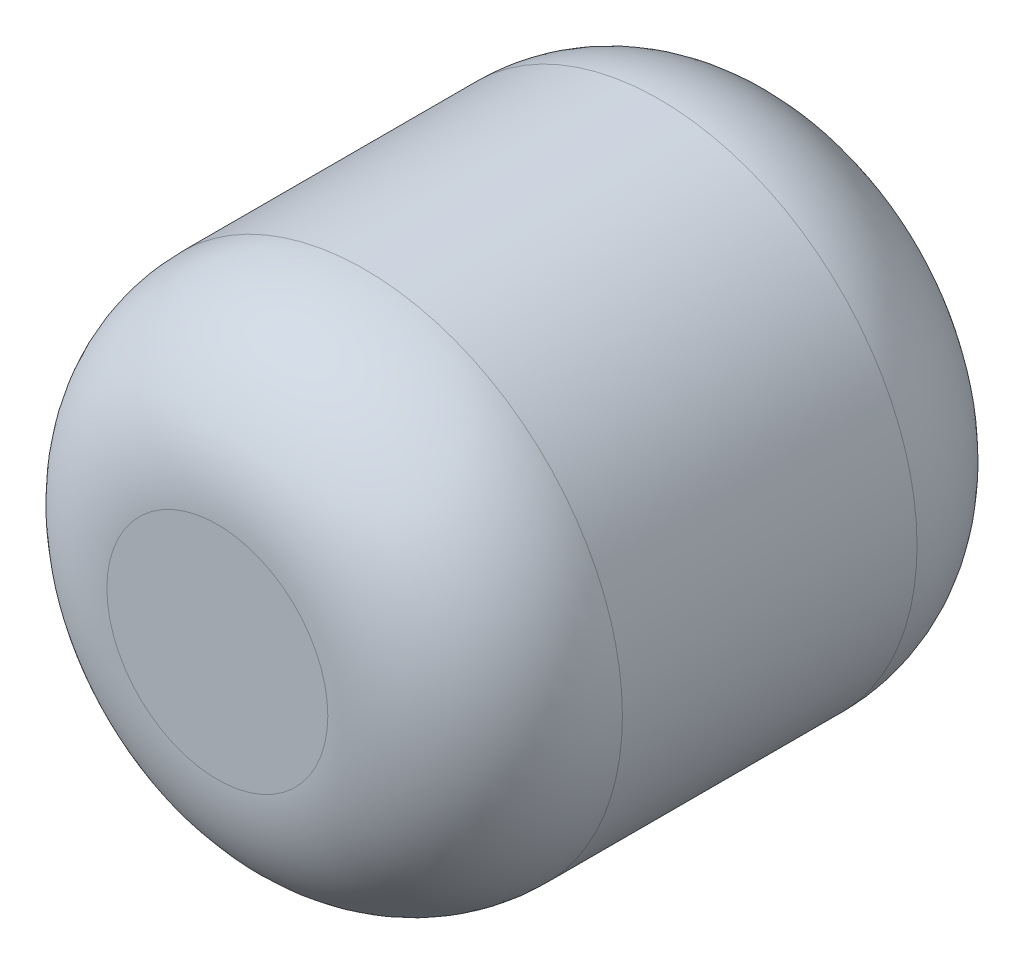
ISO-10303-21;
HEADER;
FILE_DESCRIPTION(('STEP AP214'),'2;1');
FILE_NAME('part.step','',(''),(''),'','','');
FILE_SCHEMA(('AUTOMOTIVE_DESIGN { 1 0 10303 214 1 1 1 1 }'));
ENDSEC;
DATA;
#1=APPLICATION_CONTEXT('core data for automotive mechanical design processes');
#2=APPLICATION_PROTOCOL_DEFINITION('international standard','automotive_design',2000,#1);
#3=PRODUCT_CONTEXT('',#1,'mechanical');
#4=PRODUCT('Part','Part','',(#3));
#5=PRODUCT_RELATED_PRODUCT_CATEGORY('part','',(#4));
#6=PRODUCT_DEFINITION_FORMATION('','',#4);
#7=PRODUCT_DEFINITION_CONTEXT('part definition',#1,'design');
#8=PRODUCT_DEFINITION('design','',#6,#7);
#9=PRODUCT_DEFINITION_SHAPE('','',#8);
#10=(LENGTH_UNIT() NAMED_UNIT(*) SI_UNIT(.MILLI.,.METRE.));
#11=(NAMED_UNIT(*) PLANE_ANGLE_UNIT() SI_UNIT($,.RADIAN.));
#12=(NAMED_UNIT(*) SI_UNIT($,.STERADIAN.) SOLID_ANGLE_UNIT());
#13=UNCERTAINTY_MEASURE_WITH_UNIT(LENGTH_MEASURE(1.E-05),#10,'distance_accuracy_value','');
#14=(GEOMETRIC_REPRESENTATION_CONTEXT(3) GLOBAL_UNCERTAINTY_ASSIGNED_CONTEXT((#13)) GLOBAL_UNIT_ASSIGNED_CONTEXT((#10,
#11,#12)) REPRESENTATION_CONTEXT('',''));
#15=CARTESIAN_POINT('',(0.,0.,0.));
#16=DIRECTION('',(0.,0.,1.));
#17=DIRECTION('',(1.,0.,0.));
#18=AXIS2_PLACEMENT_3D('',#15,#16,#17);
#19=CARTESIAN_POINT('',(0.,0.,101.6));
#20=DIRECTION('',(0.,0.,-1.));
#21=DIRECTION('',(-1.,0.,0.));
#22=AXIS2_PLACEMENT_3D('',#19,#20,#21);
#23=CYLINDRICAL_SURFACE('',#22,44.45);
#24=CARTESIAN_POINT('',(0.,0.,25.4));
#25=DIRECTION('',(0.,0.,1.));
#26=DIRECTION('',(1.,0.,0.));
#27=AXIS2_PLACEMENT_3D('',#24,#25,#26);
#28=CIRCLE('',#27,44.45);
#29=CARTESIAN_POINT('',(44.45,0.,25.4));
#30=VERTEX_POINT('',#29);
#31=EDGE_CURVE('E42',#30,#30,#28,.T.);
#32=ORIENTED_EDGE('',*,*,#31,.T.);
#33=EDGE_LOOP('',(#32));
#34=FACE_BOUND('',#33,.T.);
#35=CARTESIAN_POINT('',(0.,0.,76.2));
#36=DIRECTION('',(0.,0.,1.));
#37=DIRECTION('',(1.,0.,0.));
#38=AXIS2_PLACEMENT_3D('',#35,#36,#37);
#39=CIRCLE('',#38,44.45);
#40=CARTESIAN_POINT('',(44.45,0.,76.2));
#41=VERTEX_POINT('',#40);
#42=EDGE_CURVE('E46',#41,#41,#39,.F.);
#43=ORIENTED_EDGE('',*,*,#42,.T.);
#44=EDGE_LOOP('',(#43));
#45=FACE_BOUND('',#44,.T.);
#46=ADVANCED_FACE('F31',(#34,#45),#23,.T.);
#47=CARTESIAN_POINT('',(0.,0.,101.6));
#48=DIRECTION('',(0.,0.,1.));
#49=DIRECTION('',(1.,0.,0.));
#50=AXIS2_PLACEMENT_3D('',#47,#48,#49);
#51=PLANE('',#50);
#52=CARTESIAN_POINT('',(0.,0.,101.6));
#53=DIRECTION('',(0.,0.,1.));
#54=DIRECTION('',(1.,0.,0.));
#55=AXIS2_PLACEMENT_3D('',#52,#53,#54);
#56=CIRCLE('',#55,19.05);
#57=CARTESIAN_POINT('',(19.05,0.,101.6));
#58=VERTEX_POINT('',#57);
#59=EDGE_CURVE('E10',#58,#58,#56,.T.);
#60=ORIENTED_EDGE('',*,*,#59,.T.);
#61=EDGE_LOOP('',(#60));
#62=FACE_BOUND('',#61,.T.);
#63=ADVANCED_FACE('F62',(#62),#51,.T.);
#64=CARTESIAN_POINT('',(0.,0.,0.));
#65=DIRECTION('',(0.,0.,1.));
#66=DIRECTION('',(1.,0.,0.));
#67=AXIS2_PLACEMENT_3D('',#64,#65,#66);
#68=PLANE('',#67);
#69=CARTESIAN_POINT('',(0.,0.,0.));
#70=DIRECTION('',(0.,0.,1.));
#71=DIRECTION('',(1.,0.,0.));
#72=AXIS2_PLACEMENT_3D('',#69,#70,#71);
#73=CIRCLE('',#72,19.05);
#74=CARTESIAN_POINT('',(19.05,0.,0.));
#75=VERTEX_POINT('',#74);
#76=EDGE_CURVE('E38',#75,#75,#73,.F.);
#77=ORIENTED_EDGE('',*,*,#76,.T.);
#78=EDGE_LOOP('',(#77));
#79=FACE_BOUND('',#78,.T.);
#80=ADVANCED_FACE('F59',(#79),#68,.F.);
#81=CARTESIAN_POINT('',(0.,0.,25.4));
#82=DIRECTION('',(0.,0.,1.));
#83=DIRECTION('',(1.,0.,0.));
#84=AXIS2_PLACEMENT_3D('',#81,#82,#83);
#85=DEGENERATE_TOROIDAL_SURFACE('',#84,19.05,25.4,.T.);
#86=ORIENTED_EDGE('',*,*,#76,.F.);
#87=EDGE_LOOP('',(#86));
#88=FACE_BOUND('',#87,.T.);
#89=ORIENTED_EDGE('',*,*,#31,.F.);
#90=EDGE_LOOP('',(#89));
#91=FACE_BOUND('',#90,.T.);
#92=ADVANCED_FACE('F55',(#88,#91),#85,.T.);
#93=CARTESIAN_POINT('',(0.,0.,76.2));
#94=DIRECTION('',(0.,0.,1.));
#95=DIRECTION('',(1.,0.,0.));
#96=AXIS2_PLACEMENT_3D('',#93,#94,#95);
#97=DEGENERATE_TOROIDAL_SURFACE('',#96,19.05,25.4,.T.);
#98=ORIENTED_EDGE('',*,*,#42,.F.);
#99=EDGE_LOOP('',(#98));
#100=FACE_BOUND('',#99,.T.);
#101=ORIENTED_EDGE('',*,*,#59,.F.);
#102=EDGE_LOOP('',(#101));
#103=FACE_BOUND('',#102,.T.);
#104=ADVANCED_FACE('F33',(#100,#103),#97,.T.);
#105=CLOSED_SHELL('',(#46,#63,#80,#92,#104));
#106=MANIFOLD_SOLID_BREP('B2',#105);
#107=ADVANCED_BREP_SHAPE_REPRESENTATION('',(#18,#106),#14);
#108=SHAPE_DEFINITION_REPRESENTATION(#9,#107);
ENDSEC;
END-ISO-10303-21;
